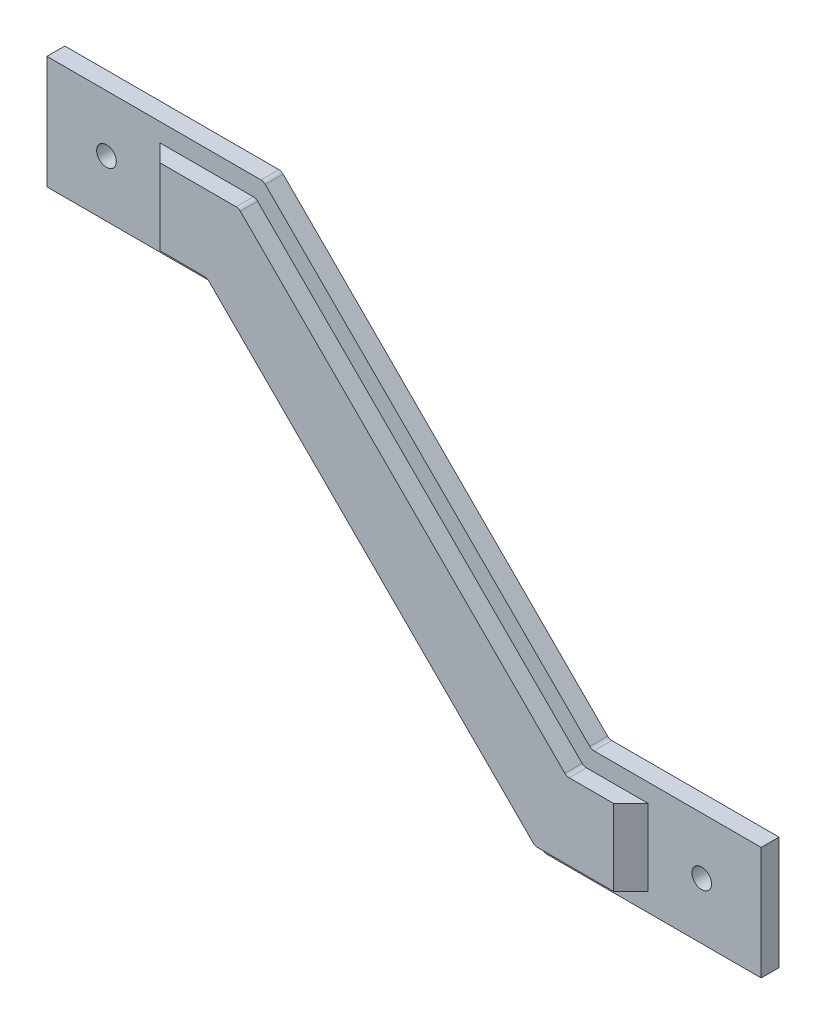
ISO-10303-21;
HEADER;
FILE_DESCRIPTION(('STEP AP214'),'2;1');
FILE_NAME('part.step','',(''),(''),'','','');
FILE_SCHEMA(('AUTOMOTIVE_DESIGN { 1 0 10303 214 1 1 1 1 }'));
ENDSEC;
DATA;
#1=APPLICATION_CONTEXT('core data for automotive mechanical design processes');
#2=APPLICATION_PROTOCOL_DEFINITION('international standard','automotive_design',2000,#1);
#3=PRODUCT_CONTEXT('',#1,'mechanical');
#4=PRODUCT('Part','Part','',(#3));
#5=PRODUCT_RELATED_PRODUCT_CATEGORY('part','',(#4));
#6=PRODUCT_DEFINITION_FORMATION('','',#4);
#7=PRODUCT_DEFINITION_CONTEXT('part definition',#1,'design');
#8=PRODUCT_DEFINITION('design','',#6,#7);
#9=PRODUCT_DEFINITION_SHAPE('','',#8);
#10=(LENGTH_UNIT() NAMED_UNIT(*) SI_UNIT(.MILLI.,.METRE.));
#11=(NAMED_UNIT(*) PLANE_ANGLE_UNIT() SI_UNIT($,.RADIAN.));
#12=(NAMED_UNIT(*) SI_UNIT($,.STERADIAN.) SOLID_ANGLE_UNIT());
#13=UNCERTAINTY_MEASURE_WITH_UNIT(LENGTH_MEASURE(1.E-05),#10,'distance_accuracy_value','');
#14=(GEOMETRIC_REPRESENTATION_CONTEXT(3) GLOBAL_UNCERTAINTY_ASSIGNED_CONTEXT((#13)) GLOBAL_UNIT_ASSIGNED_CONTEXT((#10,
#11,#12)) REPRESENTATION_CONTEXT('',''));
#15=CARTESIAN_POINT('',(0.,0.,0.));
#16=DIRECTION('',(0.,0.,1.));
#17=DIRECTION('',(1.,0.,0.));
#18=AXIS2_PLACEMENT_3D('',#15,#16,#17);
#19=CARTESIAN_POINT('',(0.,0.,3.));
#20=DIRECTION('',(0.,0.,-1.));
#21=DIRECTION('',(-1.,0.,0.));
#22=AXIS2_PLACEMENT_3D('',#19,#20,#21);
#23=PLANE('',#22);
#24=CARTESIAN_POINT('',(50.,-27.55,3.));
#25=DIRECTION('',(0.,0.,1.));
#26=DIRECTION('',(1.,0.,0.));
#27=AXIS2_PLACEMENT_3D('',#24,#25,#26);
#28=CIRCLE('',#27,1.65);
#29=CARTESIAN_POINT('',(51.65,-27.55,3.));
#30=VERTEX_POINT('',#29);
#31=EDGE_CURVE('E379',#30,#30,#28,.T.);
#32=ORIENTED_EDGE('',*,*,#31,.F.);
#33=EDGE_LOOP('',(#32));
#34=FACE_BOUND('',#33,.T.);
#35=CARTESIAN_POINT('',(-50.,27.55,3.));
#36=DIRECTION('',(0.,0.,1.));
#37=DIRECTION('',(1.,0.,0.));
#38=AXIS2_PLACEMENT_3D('',#35,#36,#37);
#39=CIRCLE('',#38,1.65);
#40=CARTESIAN_POINT('',(-48.35,27.55,3.));
#41=VERTEX_POINT('',#40);
#42=EDGE_CURVE('E331',#41,#41,#39,.T.);
#43=ORIENTED_EDGE('',*,*,#42,.F.);
#44=EDGE_LOOP('',(#43));
#45=FACE_BOUND('',#44,.T.);
#46=DIRECTION('',(-0.707106781186546,0.707106781186549,0.));
#47=VECTOR('',#46,1.);
#48=CARTESIAN_POINT('',(-23.6149711574555,37.05,3.));
#49=LINE('',#48,#47);
#50=CARTESIAN_POINT('',(31.1921356237317,-17.7571067811874,3.));
#51=VERTEX_POINT('',#50);
#52=CARTESIAN_POINT('',(-23.322077938642,36.7571067811865,3.));
#53=VERTEX_POINT('',#52);
#54=EDGE_CURVE('E368',#51,#53,#49,.T.);
#55=ORIENTED_EDGE('',*,*,#54,.T.);
#56=CARTESIAN_POINT('',(-24.0291847198286,36.05,3.));
#57=DIRECTION('',(0.,0.,-1.));
#58=DIRECTION('',(-1.,0.,0.));
#59=AXIS2_PLACEMENT_3D('',#56,#57,#58);
#60=CIRCLE('',#59,1.);
#61=CARTESIAN_POINT('',(-24.0291847198286,37.05,3.));
#62=VERTEX_POINT('',#61);
#63=EDGE_CURVE('E274',#53,#62,#60,.F.);
#64=ORIENTED_EDGE('',*,*,#63,.T.);
#65=DIRECTION('',(-1.,0.,0.));
#66=VECTOR('',#65,1.);
#67=CARTESIAN_POINT('',(-60.,37.05,3.));
#68=LINE('',#67,#66);
#69=CARTESIAN_POINT('',(-60.,37.05,3.));
#70=VERTEX_POINT('',#69);
#71=EDGE_CURVE('E213',#62,#70,#68,.T.);
#72=ORIENTED_EDGE('',*,*,#71,.T.);
#73=DIRECTION('',(0.,-1.,0.));
#74=VECTOR('',#73,1.);
#75=CARTESIAN_POINT('',(-60.,18.05,3.));
#76=LINE('',#75,#74);
#77=CARTESIAN_POINT('',(-60.,18.05,3.));
#78=VERTEX_POINT('',#77);
#79=EDGE_CURVE('E208',#70,#78,#76,.T.);
#80=ORIENTED_EDGE('',*,*,#79,.T.);
#81=DIRECTION('',(1.,0.,0.));
#82=VECTOR('',#81,1.);
#83=CARTESIAN_POINT('',(-31.4850288425443,18.05,3.));
#84=LINE('',#83,#82);
#85=CARTESIAN_POINT('',(-31.8992424049174,18.05,3.));
#86=VERTEX_POINT('',#85);
#87=EDGE_CURVE('E196',#78,#86,#84,.T.);
#88=ORIENTED_EDGE('',*,*,#87,.T.);
#89=CARTESIAN_POINT('',(-31.8992424049174,17.05,3.));
#90=DIRECTION('',(0.,0.,-1.));
#91=DIRECTION('',(-1.,0.,0.));
#92=AXIS2_PLACEMENT_3D('',#89,#90,#91);
#93=CIRCLE('',#92,1.);
#94=CARTESIAN_POINT('',(-31.1921356237309,17.7571067811866,3.));
#95=VERTEX_POINT('',#94);
#96=EDGE_CURVE('E44',#86,#95,#93,.T.);
#97=ORIENTED_EDGE('',*,*,#96,.T.);
#98=DIRECTION('',(0.707106781186547,-0.707106781186549,0.));
#99=VECTOR('',#98,1.);
#100=CARTESIAN_POINT('',(23.6149711574555,-37.05,3.));
#101=LINE('',#100,#99);
#102=CARTESIAN_POINT('',(23.3220779386421,-36.7571067811866,3.));
#103=VERTEX_POINT('',#102);
#104=EDGE_CURVE('E207',#95,#103,#101,.T.);
#105=ORIENTED_EDGE('',*,*,#104,.T.);
#106=CARTESIAN_POINT('',(24.0291847198286,-36.05,3.));
#107=DIRECTION('',(0.,0.,-1.));
#108=DIRECTION('',(-1.,0.,0.));
#109=AXIS2_PLACEMENT_3D('',#106,#107,#108);
#110=CIRCLE('',#109,1.);
#111=CARTESIAN_POINT('',(24.0291847198286,-37.05,3.));
#112=VERTEX_POINT('',#111);
#113=EDGE_CURVE('E270',#103,#112,#110,.F.);
#114=ORIENTED_EDGE('',*,*,#113,.T.);
#115=DIRECTION('',(1.,0.,0.));
#116=VECTOR('',#115,1.);
#117=CARTESIAN_POINT('',(60.,-37.05,3.));
#118=LINE('',#117,#116);
#119=CARTESIAN_POINT('',(60.,-37.05,3.));
#120=VERTEX_POINT('',#119);
#121=EDGE_CURVE('E319',#112,#120,#118,.T.);
#122=ORIENTED_EDGE('',*,*,#121,.T.);
#123=DIRECTION('',(0.,1.,0.));
#124=VECTOR('',#123,1.);
#125=CARTESIAN_POINT('',(60.,-18.05,3.));
#126=LINE('',#125,#124);
#127=CARTESIAN_POINT('',(60.,-18.05,3.));
#128=VERTEX_POINT('',#127);
#129=EDGE_CURVE('E371',#120,#128,#126,.T.);
#130=ORIENTED_EDGE('',*,*,#129,.T.);
#131=DIRECTION('',(-1.,0.,0.));
#132=VECTOR('',#131,1.);
#133=CARTESIAN_POINT('',(31.4850288425451,-18.0500000000008,3.));
#134=LINE('',#133,#132);
#135=CARTESIAN_POINT('',(31.8992424049183,-18.0500000000008,3.));
#136=VERTEX_POINT('',#135);
#137=EDGE_CURVE('E354',#128,#136,#134,.T.);
#138=ORIENTED_EDGE('',*,*,#137,.T.);
#139=CARTESIAN_POINT('',(31.8992424049182,-17.0500000000008,3.));
#140=DIRECTION('',(0.,0.,-1.));
#141=DIRECTION('',(-1.,0.,0.));
#142=AXIS2_PLACEMENT_3D('',#139,#140,#141);
#143=CIRCLE('',#142,1.);
#144=EDGE_CURVE('E303',#136,#51,#143,.T.);
#145=ORIENTED_EDGE('',*,*,#144,.T.);
#146=EDGE_LOOP('',(#55,#64,#72,#80,#88,#97,#105,#114,#122,#130,#138,#145));
#147=FACE_BOUND('',#146,.T.);
#148=DIRECTION('',(-0.707106781186548,0.707106781186548,0.));
#149=VECTOR('',#148,1.);
#150=CARTESIAN_POINT('',(30.2009667991878,-21.15,3.));
#151=LINE('',#150,#149);
#152=CARTESIAN_POINT('',(29.9080735803744,-20.8571067811866,3.));
#153=VERTEX_POINT('',#152);
#154=CARTESIAN_POINT('',(-24.6061399819987,33.6571067811865,3.));
#155=VERTEX_POINT('',#154);
#156=EDGE_CURVE('E388',#153,#155,#151,.T.);
#157=ORIENTED_EDGE('',*,*,#156,.F.);
#158=CARTESIAN_POINT('',(30.6151803615609,-20.15,3.));
#159=DIRECTION('',(0.,0.,-1.));
#160=DIRECTION('',(-1.,0.,0.));
#161=AXIS2_PLACEMENT_3D('',#158,#159,#160);
#162=CIRCLE('',#161,1.);
#163=CARTESIAN_POINT('',(30.6151803615609,-21.15,3.));
#164=VERTEX_POINT('',#163);
#165=EDGE_CURVE('E272',#153,#164,#162,.F.);
#166=ORIENTED_EDGE('',*,*,#165,.T.);
#167=DIRECTION('',(-1.,0.,0.));
#168=VECTOR('',#167,1.);
#169=CARTESIAN_POINT('',(41.,-21.15,3.));
#170=LINE('',#169,#168);
#171=CARTESIAN_POINT('',(41.,-21.15,3.));
#172=VERTEX_POINT('',#171);
#173=EDGE_CURVE('E392',#172,#164,#170,.T.);
#174=ORIENTED_EDGE('',*,*,#173,.F.);
#175=DIRECTION('',(0.,1.,0.));
#176=VECTOR('',#175,1.);
#177=CARTESIAN_POINT('',(41.,-33.95,3.));
#178=LINE('',#177,#176);
#179=CARTESIAN_POINT('',(41.,-33.95,3.));
#180=VERTEX_POINT('',#179);
#181=EDGE_CURVE('E395',#180,#172,#178,.T.);
#182=ORIENTED_EDGE('',*,*,#181,.F.);
#183=DIRECTION('',(1.,0.,0.));
#184=VECTOR('',#183,1.);
#185=CARTESIAN_POINT('',(24.8990332008122,-33.95,3.));
#186=LINE('',#185,#184);
#187=CARTESIAN_POINT('',(25.3132467631853,-33.95,3.));
#188=VERTEX_POINT('',#187);
#189=EDGE_CURVE('E398',#188,#180,#186,.T.);
#190=ORIENTED_EDGE('',*,*,#189,.F.);
#191=CARTESIAN_POINT('',(25.3132467631853,-32.95,3.));
#192=DIRECTION('',(0.,0.,-1.));
#193=DIRECTION('',(-1.,0.,0.));
#194=AXIS2_PLACEMENT_3D('',#191,#192,#193);
#195=CIRCLE('',#194,1.);
#196=CARTESIAN_POINT('',(24.6061399819988,-33.6571067811866,3.));
#197=VERTEX_POINT('',#196);
#198=EDGE_CURVE('E57',#188,#197,#195,.T.);
#199=ORIENTED_EDGE('',*,*,#198,.T.);
#200=DIRECTION('',(0.707106781186548,-0.707106781186547,0.));
#201=VECTOR('',#200,1.);
#202=CARTESIAN_POINT('',(-30.2009667991878,21.15,3.));
#203=LINE('',#202,#201);
#204=CARTESIAN_POINT('',(-29.9080735803744,20.8571067811865,3.));
#205=VERTEX_POINT('',#204);
#206=EDGE_CURVE('E400',#205,#197,#203,.T.);
#207=ORIENTED_EDGE('',*,*,#206,.F.);
#208=CARTESIAN_POINT('',(-30.6151803615609,20.15,3.));
#209=DIRECTION('',(0.,0.,-1.));
#210=DIRECTION('',(-1.,0.,0.));
#211=AXIS2_PLACEMENT_3D('',#208,#209,#210);
#212=CIRCLE('',#211,1.);
#213=CARTESIAN_POINT('',(-30.6151803615609,21.15,3.));
#214=VERTEX_POINT('',#213);
#215=EDGE_CURVE('E51',#205,#214,#212,.F.);
#216=ORIENTED_EDGE('',*,*,#215,.T.);
#217=DIRECTION('',(1.,0.,0.));
#218=VECTOR('',#217,1.);
#219=CARTESIAN_POINT('',(-41.,21.15,3.));
#220=LINE('',#219,#218);
#221=CARTESIAN_POINT('',(-41.,21.15,3.));
#222=VERTEX_POINT('',#221);
#223=EDGE_CURVE('E402',#222,#214,#220,.T.);
#224=ORIENTED_EDGE('',*,*,#223,.F.);
#225=DIRECTION('',(0.,-1.,0.));
#226=VECTOR('',#225,1.);
#227=CARTESIAN_POINT('',(-41.,33.95,3.));
#228=LINE('',#227,#226);
#229=CARTESIAN_POINT('',(-41.,33.95,3.));
#230=VERTEX_POINT('',#229);
#231=EDGE_CURVE('E404',#230,#222,#228,.T.);
#232=ORIENTED_EDGE('',*,*,#231,.F.);
#233=DIRECTION('',(-1.,0.,0.));
#234=VECTOR('',#233,1.);
#235=CARTESIAN_POINT('',(-24.8990332008122,33.95,3.));
#236=LINE('',#235,#234);
#237=CARTESIAN_POINT('',(-25.3132467631853,33.95,3.));
#238=VERTEX_POINT('',#237);
#239=EDGE_CURVE('E407',#238,#230,#236,.T.);
#240=ORIENTED_EDGE('',*,*,#239,.F.);
#241=CARTESIAN_POINT('',(-25.3132467631853,32.95,3.));
#242=DIRECTION('',(0.,0.,-1.));
#243=DIRECTION('',(-1.,0.,0.));
#244=AXIS2_PLACEMENT_3D('',#241,#242,#243);
#245=CIRCLE('',#244,1.);
#246=EDGE_CURVE('E299',#238,#155,#245,.T.);
#247=ORIENTED_EDGE('',*,*,#246,.T.);
#248=EDGE_LOOP('',(#157,#166,#174,#182,#190,#199,#207,#216,#224,#232,#240,#247));
#249=FACE_BOUND('',#248,.T.);
#250=ADVANCED_FACE('F36',(#34,#45,#147,#249),#23,.F.);
#251=CARTESIAN_POINT('',(0.,0.,0.));
#252=DIRECTION('',(0.,0.,-1.));
#253=DIRECTION('',(-1.,0.,0.));
#254=AXIS2_PLACEMENT_3D('',#251,#252,#253);
#255=PLANE('',#254);
#256=CARTESIAN_POINT('',(-50.,27.55,0.));
#257=DIRECTION('',(0.,0.,1.));
#258=DIRECTION('',(1.,0.,0.));
#259=AXIS2_PLACEMENT_3D('',#256,#257,#258);
#260=CIRCLE('',#259,1.65);
#261=CARTESIAN_POINT('',(-48.35,27.55,0.));
#262=VERTEX_POINT('',#261);
#263=EDGE_CURVE('E376',#262,#262,#260,.T.);
#264=ORIENTED_EDGE('',*,*,#263,.T.);
#265=EDGE_LOOP('',(#264));
#266=FACE_BOUND('',#265,.T.);
#267=DIRECTION('',(-1.,0.,0.));
#268=VECTOR('',#267,1.);
#269=CARTESIAN_POINT('',(-60.,37.05,0.));
#270=LINE('',#269,#268);
#271=CARTESIAN_POINT('',(-24.0291847198286,37.05,0.));
#272=VERTEX_POINT('',#271);
#273=CARTESIAN_POINT('',(-60.,37.05,0.));
#274=VERTEX_POINT('',#273);
#275=EDGE_CURVE('E217',#272,#274,#270,.T.);
#276=ORIENTED_EDGE('',*,*,#275,.F.);
#277=CARTESIAN_POINT('',(-24.0291847198286,36.05,0.));
#278=DIRECTION('',(0.,0.,-1.));
#279=DIRECTION('',(-1.,0.,0.));
#280=AXIS2_PLACEMENT_3D('',#277,#278,#279);
#281=CIRCLE('',#280,1.);
#282=CARTESIAN_POINT('',(-23.322077938642,36.7571067811865,0.));
#283=VERTEX_POINT('',#282);
#284=EDGE_CURVE('E262',#272,#283,#281,.T.);
#285=ORIENTED_EDGE('',*,*,#284,.T.);
#286=DIRECTION('',(-0.707106781186546,0.707106781186549,0.));
#287=VECTOR('',#286,1.);
#288=CARTESIAN_POINT('',(-23.6149711574555,37.05,0.));
#289=LINE('',#288,#287);
#290=CARTESIAN_POINT('',(31.1921356237317,-17.7571067811874,0.));
#291=VERTEX_POINT('',#290);
#292=EDGE_CURVE('E341',#291,#283,#289,.T.);
#293=ORIENTED_EDGE('',*,*,#292,.F.);
#294=CARTESIAN_POINT('',(31.8992424049182,-17.0500000000008,0.));
#295=DIRECTION('',(0.,0.,-1.));
#296=DIRECTION('',(-1.,0.,0.));
#297=AXIS2_PLACEMENT_3D('',#294,#295,#296);
#298=CIRCLE('',#297,1.);
#299=CARTESIAN_POINT('',(31.8992424049183,-18.0500000000008,0.));
#300=VERTEX_POINT('',#299);
#301=EDGE_CURVE('E301',#291,#300,#298,.F.);
#302=ORIENTED_EDGE('',*,*,#301,.T.);
#303=DIRECTION('',(-1.,0.,0.));
#304=VECTOR('',#303,1.);
#305=CARTESIAN_POINT('',(31.4850288425451,-18.0500000000008,0.));
#306=LINE('',#305,#304);
#307=CARTESIAN_POINT('',(60.,-18.05,0.));
#308=VERTEX_POINT('',#307);
#309=EDGE_CURVE('E338',#308,#300,#306,.T.);
#310=ORIENTED_EDGE('',*,*,#309,.F.);
#311=DIRECTION('',(0.,1.,0.));
#312=VECTOR('',#311,1.);
#313=CARTESIAN_POINT('',(60.,-18.05,0.));
#314=LINE('',#313,#312);
#315=CARTESIAN_POINT('',(60.,-37.05,0.));
#316=VERTEX_POINT('',#315);
#317=EDGE_CURVE('E336',#316,#308,#314,.T.);
#318=ORIENTED_EDGE('',*,*,#317,.F.);
#319=DIRECTION('',(1.,0.,0.));
#320=VECTOR('',#319,1.);
#321=CARTESIAN_POINT('',(60.,-37.05,0.));
#322=LINE('',#321,#320);
#323=CARTESIAN_POINT('',(24.0291847198286,-37.05,0.));
#324=VERTEX_POINT('',#323);
#325=EDGE_CURVE('E329',#324,#316,#322,.T.);
#326=ORIENTED_EDGE('',*,*,#325,.F.);
#327=CARTESIAN_POINT('',(24.0291847198286,-36.05,0.));
#328=DIRECTION('',(0.,0.,-1.));
#329=DIRECTION('',(-1.,0.,0.));
#330=AXIS2_PLACEMENT_3D('',#327,#328,#329);
#331=CIRCLE('',#330,1.);
#332=CARTESIAN_POINT('',(23.3220779386421,-36.7571067811866,0.));
#333=VERTEX_POINT('',#332);
#334=EDGE_CURVE('E260',#324,#333,#331,.T.);
#335=ORIENTED_EDGE('',*,*,#334,.T.);
#336=DIRECTION('',(0.707106781186547,-0.707106781186549,0.));
#337=VECTOR('',#336,1.);
#338=CARTESIAN_POINT('',(23.6149711574555,-37.05,0.));
#339=LINE('',#338,#337);
#340=CARTESIAN_POINT('',(-31.1921356237309,17.7571067811866,0.));
#341=VERTEX_POINT('',#340);
#342=EDGE_CURVE('E327',#341,#333,#339,.T.);
#343=ORIENTED_EDGE('',*,*,#342,.F.);
#344=CARTESIAN_POINT('',(-31.8992424049174,17.05,0.));
#345=DIRECTION('',(0.,0.,-1.));
#346=DIRECTION('',(-1.,0.,0.));
#347=AXIS2_PLACEMENT_3D('',#344,#345,#346);
#348=CIRCLE('',#347,1.);
#349=CARTESIAN_POINT('',(-31.8992424049174,18.05,0.));
#350=VERTEX_POINT('',#349);
#351=EDGE_CURVE('E308',#341,#350,#348,.F.);
#352=ORIENTED_EDGE('',*,*,#351,.T.);
#353=DIRECTION('',(1.,0.,0.));
#354=VECTOR('',#353,1.);
#355=CARTESIAN_POINT('',(-31.4850288425443,18.05,0.));
#356=LINE('',#355,#354);
#357=CARTESIAN_POINT('',(-60.,18.05,0.));
#358=VERTEX_POINT('',#357);
#359=EDGE_CURVE('E326',#358,#350,#356,.T.);
#360=ORIENTED_EDGE('',*,*,#359,.F.);
#361=DIRECTION('',(0.,-1.,0.));
#362=VECTOR('',#361,1.);
#363=CARTESIAN_POINT('',(-60.,18.05,0.));
#364=LINE('',#363,#362);
#365=EDGE_CURVE('E221',#274,#358,#364,.T.);
#366=ORIENTED_EDGE('',*,*,#365,.F.);
#367=EDGE_LOOP('',(#276,#285,#293,#302,#310,#318,#326,#335,#343,#352,#360,#366));
#368=FACE_BOUND('',#367,.T.);
#369=CARTESIAN_POINT('',(50.,-27.55,0.));
#370=DIRECTION('',(0.,0.,1.));
#371=DIRECTION('',(1.,0.,0.));
#372=AXIS2_PLACEMENT_3D('',#369,#370,#371);
#373=CIRCLE('',#372,1.65);
#374=CARTESIAN_POINT('',(51.65,-27.55,0.));
#375=VERTEX_POINT('',#374);
#376=EDGE_CURVE('E382',#375,#375,#373,.T.);
#377=ORIENTED_EDGE('',*,*,#376,.T.);
#378=EDGE_LOOP('',(#377));
#379=FACE_BOUND('',#378,.T.);
#380=ADVANCED_FACE('F324',(#266,#368,#379),#255,.T.);
#381=CARTESIAN_POINT('',(-60.,18.05,3.));
#382=DIRECTION('',(1.,0.,0.));
#383=DIRECTION('',(0.,0.,-1.));
#384=AXIS2_PLACEMENT_3D('',#381,#382,#383);
#385=PLANE('',#384);
#386=ORIENTED_EDGE('',*,*,#365,.T.);
#387=DIRECTION('',(0.,0.,-1.));
#388=VECTOR('',#387,1.);
#389=CARTESIAN_POINT('',(-60.,18.05,3.));
#390=LINE('',#389,#388);
#391=EDGE_CURVE('E201',#78,#358,#390,.T.);
#392=ORIENTED_EDGE('',*,*,#391,.F.);
#393=ORIENTED_EDGE('',*,*,#79,.F.);
#394=DIRECTION('',(0.,0.,-1.));
#395=VECTOR('',#394,1.);
#396=CARTESIAN_POINT('',(-60.,37.05,3.));
#397=LINE('',#396,#395);
#398=EDGE_CURVE('E345',#70,#274,#397,.T.);
#399=ORIENTED_EDGE('',*,*,#398,.T.);
#400=EDGE_LOOP('',(#386,#392,#393,#399));
#401=FACE_BOUND('',#400,.T.);
#402=ADVANCED_FACE('F219',(#401),#385,.F.);
#403=CARTESIAN_POINT('',(-31.4850288425443,18.05,3.));
#404=DIRECTION('',(0.,1.,0.));
#405=DIRECTION('',(-1.,0.,0.));
#406=AXIS2_PLACEMENT_3D('',#403,#404,#405);
#407=PLANE('',#406);
#408=ORIENTED_EDGE('',*,*,#359,.T.);
#409=DIRECTION('',(0.,0.,-1.));
#410=VECTOR('',#409,1.);
#411=CARTESIAN_POINT('',(-31.8992424049174,18.05,3.));
#412=LINE('',#411,#410);
#413=EDGE_CURVE('E204',#350,#86,#412,.F.);
#414=ORIENTED_EDGE('',*,*,#413,.T.);
#415=ORIENTED_EDGE('',*,*,#87,.F.);
#416=ORIENTED_EDGE('',*,*,#391,.T.);
#417=EDGE_LOOP('',(#408,#414,#415,#416));
#418=FACE_BOUND('',#417,.T.);
#419=ADVANCED_FACE('F199',(#418),#407,.F.);
#420=CARTESIAN_POINT('',(23.6149711574555,-37.05,3.));
#421=DIRECTION('',(0.707106781186548,0.707106781186546,0.));
#422=DIRECTION('',(-0.707106781186547,0.707106781186549,0.));
#423=AXIS2_PLACEMENT_3D('',#420,#421,#422);
#424=PLANE('',#423);
#425=ORIENTED_EDGE('',*,*,#342,.T.);
#426=DIRECTION('',(0.,0.,-1.));
#427=VECTOR('',#426,1.);
#428=CARTESIAN_POINT('',(23.3220779386421,-36.7571067811866,3.));
#429=LINE('',#428,#427);
#430=EDGE_CURVE('E286',#333,#103,#429,.F.);
#431=ORIENTED_EDGE('',*,*,#430,.T.);
#432=ORIENTED_EDGE('',*,*,#104,.F.);
#433=DIRECTION('',(0.,0.,-1.));
#434=VECTOR('',#433,1.);
#435=CARTESIAN_POINT('',(-31.1921356237309,17.7571067811866,0.));
#436=LINE('',#435,#434);
#437=EDGE_CURVE('E283',#95,#341,#436,.T.);
#438=ORIENTED_EDGE('',*,*,#437,.T.);
#439=EDGE_LOOP('',(#425,#431,#432,#438));
#440=FACE_BOUND('',#439,.T.);
#441=ADVANCED_FACE('F316',(#440),#424,.F.);
#442=CARTESIAN_POINT('',(60.,-37.05,3.));
#443=DIRECTION('',(0.,1.,0.));
#444=DIRECTION('',(-1.,0.,0.));
#445=AXIS2_PLACEMENT_3D('',#442,#443,#444);
#446=PLANE('',#445);
#447=ORIENTED_EDGE('',*,*,#121,.F.);
#448=DIRECTION('',(0.,0.,-1.));
#449=VECTOR('',#448,1.);
#450=CARTESIAN_POINT('',(24.0291847198286,-37.05,3.));
#451=LINE('',#450,#449);
#452=EDGE_CURVE('E280',#112,#324,#451,.T.);
#453=ORIENTED_EDGE('',*,*,#452,.T.);
#454=ORIENTED_EDGE('',*,*,#325,.T.);
#455=DIRECTION('',(0.,0.,-1.));
#456=VECTOR('',#455,1.);
#457=CARTESIAN_POINT('',(60.,-37.05,3.));
#458=LINE('',#457,#456);
#459=EDGE_CURVE('E223',#120,#316,#458,.T.);
#460=ORIENTED_EDGE('',*,*,#459,.F.);
#461=EDGE_LOOP('',(#447,#453,#454,#460));
#462=FACE_BOUND('',#461,.T.);
#463=ADVANCED_FACE('F483',(#462),#446,.F.);
#464=CARTESIAN_POINT('',(60.,-18.05,3.));
#465=DIRECTION('',(-1.,0.,0.));
#466=DIRECTION('',(0.,0.,1.));
#467=AXIS2_PLACEMENT_3D('',#464,#465,#466);
#468=PLANE('',#467);
#469=ORIENTED_EDGE('',*,*,#317,.T.);
#470=DIRECTION('',(0.,0.,-1.));
#471=VECTOR('',#470,1.);
#472=CARTESIAN_POINT('',(60.,-18.05,3.));
#473=LINE('',#472,#471);
#474=EDGE_CURVE('E229',#128,#308,#473,.T.);
#475=ORIENTED_EDGE('',*,*,#474,.F.);
#476=ORIENTED_EDGE('',*,*,#129,.F.);
#477=ORIENTED_EDGE('',*,*,#459,.T.);
#478=EDGE_LOOP('',(#469,#475,#476,#477));
#479=FACE_BOUND('',#478,.T.);
#480=ADVANCED_FACE('F480',(#479),#468,.F.);
#481=CARTESIAN_POINT('',(31.4850288425451,-18.0500000000008,3.));
#482=DIRECTION('',(0.,-1.,0.));
#483=DIRECTION('',(1.,0.,0.));
#484=AXIS2_PLACEMENT_3D('',#481,#482,#483);
#485=PLANE('',#484);
#486=ORIENTED_EDGE('',*,*,#309,.T.);
#487=DIRECTION('',(0.,0.,-1.));
#488=VECTOR('',#487,1.);
#489=CARTESIAN_POINT('',(31.8992424049183,-18.0500000000008,3.));
#490=LINE('',#489,#488);
#491=EDGE_CURVE('E276',#300,#136,#490,.F.);
#492=ORIENTED_EDGE('',*,*,#491,.T.);
#493=ORIENTED_EDGE('',*,*,#137,.F.);
#494=ORIENTED_EDGE('',*,*,#474,.T.);
#495=EDGE_LOOP('',(#486,#492,#493,#494));
#496=FACE_BOUND('',#495,.T.);
#497=ADVANCED_FACE('F351',(#496),#485,.F.);
#498=CARTESIAN_POINT('',(-23.6149711574555,37.05,3.));
#499=DIRECTION('',(-0.707106781186549,-0.707106781186546,0.));
#500=DIRECTION('',(0.707106781186546,-0.707106781186549,0.));
#501=AXIS2_PLACEMENT_3D('',#498,#499,#500);
#502=PLANE('',#501);
#503=ORIENTED_EDGE('',*,*,#292,.T.);
#504=DIRECTION('',(0.,0.,-1.));
#505=VECTOR('',#504,1.);
#506=CARTESIAN_POINT('',(-23.322077938642,36.7571067811865,3.));
#507=LINE('',#506,#505);
#508=EDGE_CURVE('E267',#283,#53,#507,.F.);
#509=ORIENTED_EDGE('',*,*,#508,.T.);
#510=ORIENTED_EDGE('',*,*,#54,.F.);
#511=DIRECTION('',(0.,0.,-1.));
#512=VECTOR('',#511,1.);
#513=CARTESIAN_POINT('',(31.1921356237317,-17.7571067811874,0.));
#514=LINE('',#513,#512);
#515=EDGE_CURVE('E264',#51,#291,#514,.T.);
#516=ORIENTED_EDGE('',*,*,#515,.T.);
#517=EDGE_LOOP('',(#503,#509,#510,#516));
#518=FACE_BOUND('',#517,.T.);
#519=ADVANCED_FACE('F366',(#518),#502,.F.);
#520=CARTESIAN_POINT('',(-60.,37.05,3.));
#521=DIRECTION('',(0.,-1.,0.));
#522=DIRECTION('',(0.,0.,-1.));
#523=AXIS2_PLACEMENT_3D('',#520,#521,#522);
#524=PLANE('',#523);
#525=ORIENTED_EDGE('',*,*,#71,.F.);
#526=DIRECTION('',(0.,0.,-1.));
#527=VECTOR('',#526,1.);
#528=CARTESIAN_POINT('',(-24.0291847198286,37.05,3.));
#529=LINE('',#528,#527);
#530=EDGE_CURVE('E257',#62,#272,#529,.T.);
#531=ORIENTED_EDGE('',*,*,#530,.T.);
#532=ORIENTED_EDGE('',*,*,#275,.T.);
#533=ORIENTED_EDGE('',*,*,#398,.F.);
#534=EDGE_LOOP('',(#525,#531,#532,#533));
#535=FACE_BOUND('',#534,.T.);
#536=ADVANCED_FACE('F472',(#535),#524,.F.);
#537=CARTESIAN_POINT('',(-50.,27.55,3.));
#538=DIRECTION('',(0.,0.,-1.));
#539=DIRECTION('',(-1.,0.,0.));
#540=AXIS2_PLACEMENT_3D('',#537,#538,#539);
#541=CYLINDRICAL_SURFACE('',#540,1.65);
#542=ORIENTED_EDGE('',*,*,#42,.T.);
#543=EDGE_LOOP('',(#542));
#544=FACE_BOUND('',#543,.T.);
#545=ORIENTED_EDGE('',*,*,#263,.F.);
#546=EDGE_LOOP('',(#545));
#547=FACE_BOUND('',#546,.T.);
#548=ADVANCED_FACE('F469',(#544,#547),#541,.F.);
#549=CARTESIAN_POINT('',(50.,-27.55,3.));
#550=DIRECTION('',(0.,0.,-1.));
#551=DIRECTION('',(-1.,0.,0.));
#552=AXIS2_PLACEMENT_3D('',#549,#550,#551);
#553=CYLINDRICAL_SURFACE('',#552,1.65);
#554=ORIENTED_EDGE('',*,*,#31,.T.);
#555=EDGE_LOOP('',(#554));
#556=FACE_BOUND('',#555,.T.);
#557=ORIENTED_EDGE('',*,*,#376,.F.);
#558=EDGE_LOOP('',(#557));
#559=FACE_BOUND('',#558,.T.);
#560=ADVANCED_FACE('F644',(#556,#559),#553,.F.);
#561=CARTESIAN_POINT('',(-24.8990332008122,33.95,5.9));
#562=DIRECTION('',(0.,-1.,0.));
#563=DIRECTION('',(0.,0.,-1.));
#564=AXIS2_PLACEMENT_3D('',#561,#562,#563);
#565=PLANE('',#564);
#566=DIRECTION('',(-1.,0.,0.));
#567=VECTOR('',#566,1.);
#568=CARTESIAN_POINT('',(-24.8990332008122,33.95,5.9));
#569=LINE('',#568,#567);
#570=CARTESIAN_POINT('',(-25.3132467631853,33.95,5.9));
#571=VERTEX_POINT('',#570);
#572=CARTESIAN_POINT('',(-38.1,33.95,5.9));
#573=VERTEX_POINT('',#572);
#574=EDGE_CURVE('E391',#571,#573,#569,.T.);
#575=ORIENTED_EDGE('',*,*,#574,.F.);
#576=DIRECTION('',(0.,0.,-1.));
#577=VECTOR('',#576,1.);
#578=CARTESIAN_POINT('',(-25.3132467631853,33.95,5.9));
#579=LINE('',#578,#577);
#580=EDGE_CURVE('E245',#571,#238,#579,.T.);
#581=ORIENTED_EDGE('',*,*,#580,.T.);
#582=ORIENTED_EDGE('',*,*,#239,.T.);
#583=DIRECTION('',(0.707106781186548,0.,0.707106781186548));
#584=VECTOR('',#583,1.);
#585=CARTESIAN_POINT('',(-38.1,33.95,5.9));
#586=LINE('',#585,#584);
#587=EDGE_CURVE('E242',#230,#573,#586,.T.);
#588=ORIENTED_EDGE('',*,*,#587,.T.);
#589=EDGE_LOOP('',(#575,#581,#582,#588));
#590=FACE_BOUND('',#589,.T.);
#591=ADVANCED_FACE('F431',(#590),#565,.F.);
#592=CARTESIAN_POINT('',(-41.,21.15,5.9));
#593=DIRECTION('',(0.,1.,0.));
#594=DIRECTION('',(0.,0.,1.));
#595=AXIS2_PLACEMENT_3D('',#592,#593,#594);
#596=PLANE('',#595);
#597=ORIENTED_EDGE('',*,*,#223,.T.);
#598=DIRECTION('',(0.,0.,-1.));
#599=VECTOR('',#598,1.);
#600=CARTESIAN_POINT('',(-30.6151803615609,21.15,5.9));
#601=LINE('',#600,#599);
#602=CARTESIAN_POINT('',(-30.6151803615609,21.15,5.9));
#603=VERTEX_POINT('',#602);
#604=EDGE_CURVE('E297',#214,#603,#601,.F.);
#605=ORIENTED_EDGE('',*,*,#604,.T.);
#606=DIRECTION('',(1.,0.,0.));
#607=VECTOR('',#606,1.);
#608=CARTESIAN_POINT('',(-41.,21.15,5.9));
#609=LINE('',#608,#607);
#610=CARTESIAN_POINT('',(-38.1,21.15,5.9));
#611=VERTEX_POINT('',#610);
#612=EDGE_CURVE('E419',#611,#603,#609,.T.);
#613=ORIENTED_EDGE('',*,*,#612,.F.);
#614=DIRECTION('',(-0.707106781186548,0.,-0.707106781186548));
#615=VECTOR('',#614,1.);
#616=CARTESIAN_POINT('',(-38.1,21.15,5.9));
#617=LINE('',#616,#615);
#618=EDGE_CURVE('E240',#611,#222,#617,.T.);
#619=ORIENTED_EDGE('',*,*,#618,.T.);
#620=EDGE_LOOP('',(#597,#605,#613,#619));
#621=FACE_BOUND('',#620,.T.);
#622=ADVANCED_FACE('F437',(#621),#596,.F.);
#623=CARTESIAN_POINT('',(-30.2009667991878,21.15,5.9));
#624=DIRECTION('',(0.707106781186547,0.707106781186548,0.));
#625=DIRECTION('',(-0.707106781186548,0.707106781186547,0.));
#626=AXIS2_PLACEMENT_3D('',#623,#624,#625);
#627=PLANE('',#626);
#628=ORIENTED_EDGE('',*,*,#206,.T.);
#629=DIRECTION('',(0.,0.,-1.));
#630=VECTOR('',#629,1.);
#631=CARTESIAN_POINT('',(24.6061399819988,-33.6571067811866,5.9));
#632=LINE('',#631,#630);
#633=CARTESIAN_POINT('',(24.6061399819988,-33.6571067811866,5.9));
#634=VERTEX_POINT('',#633);
#635=EDGE_CURVE('E294',#197,#634,#632,.F.);
#636=ORIENTED_EDGE('',*,*,#635,.T.);
#637=DIRECTION('',(0.707106781186548,-0.707106781186547,0.));
#638=VECTOR('',#637,1.);
#639=CARTESIAN_POINT('',(-30.2009667991878,21.15,5.9));
#640=LINE('',#639,#638);
#641=CARTESIAN_POINT('',(-29.9080735803744,20.8571067811865,5.9));
#642=VERTEX_POINT('',#641);
#643=EDGE_CURVE('E416',#642,#634,#640,.T.);
#644=ORIENTED_EDGE('',*,*,#643,.F.);
#645=DIRECTION('',(0.,0.,-1.));
#646=VECTOR('',#645,1.);
#647=CARTESIAN_POINT('',(-29.9080735803744,20.8571067811865,3.));
#648=LINE('',#647,#646);
#649=EDGE_CURVE('E291',#642,#205,#648,.T.);
#650=ORIENTED_EDGE('',*,*,#649,.T.);
#651=EDGE_LOOP('',(#628,#636,#644,#650));
#652=FACE_BOUND('',#651,.T.);
#653=ADVANCED_FACE('F526',(#652),#627,.F.);
#654=CARTESIAN_POINT('',(24.8990332008122,-33.95,5.9));
#655=DIRECTION('',(0.,1.,0.));
#656=DIRECTION('',(0.,0.,1.));
#657=AXIS2_PLACEMENT_3D('',#654,#655,#656);
#658=PLANE('',#657);
#659=DIRECTION('',(1.,0.,0.));
#660=VECTOR('',#659,1.);
#661=CARTESIAN_POINT('',(24.8990332008122,-33.95,5.9));
#662=LINE('',#661,#660);
#663=CARTESIAN_POINT('',(25.3132467631853,-33.95,5.9));
#664=VERTEX_POINT('',#663);
#665=CARTESIAN_POINT('',(38.1,-33.95,5.9));
#666=VERTEX_POINT('',#665);
#667=EDGE_CURVE('E414',#664,#666,#662,.T.);
#668=ORIENTED_EDGE('',*,*,#667,.F.);
#669=DIRECTION('',(0.,0.,-1.));
#670=VECTOR('',#669,1.);
#671=CARTESIAN_POINT('',(25.3132467631853,-33.95,5.9));
#672=LINE('',#671,#670);
#673=EDGE_CURVE('E288',#664,#188,#672,.T.);
#674=ORIENTED_EDGE('',*,*,#673,.T.);
#675=ORIENTED_EDGE('',*,*,#189,.T.);
#676=DIRECTION('',(-0.707106781186548,0.,0.707106781186548));
#677=VECTOR('',#676,1.);
#678=CARTESIAN_POINT('',(38.1,-33.95,5.9));
#679=LINE('',#678,#677);
#680=EDGE_CURVE('E237',#180,#666,#679,.T.);
#681=ORIENTED_EDGE('',*,*,#680,.T.);
#682=EDGE_LOOP('',(#668,#674,#675,#681));
#683=FACE_BOUND('',#682,.T.);
#684=ADVANCED_FACE('F510',(#683),#658,.F.);
#685=CARTESIAN_POINT('',(41.,-21.15,5.9));
#686=DIRECTION('',(0.,-1.,0.));
#687=DIRECTION('',(0.,0.,-1.));
#688=AXIS2_PLACEMENT_3D('',#685,#686,#687);
#689=PLANE('',#688);
#690=ORIENTED_EDGE('',*,*,#173,.T.);
#691=DIRECTION('',(0.,0.,-1.));
#692=VECTOR('',#691,1.);
#693=CARTESIAN_POINT('',(30.6151803615609,-21.15,5.9));
#694=LINE('',#693,#692);
#695=CARTESIAN_POINT('',(30.6151803615609,-21.15,5.9));
#696=VERTEX_POINT('',#695);
#697=EDGE_CURVE('E278',#164,#696,#694,.F.);
#698=ORIENTED_EDGE('',*,*,#697,.T.);
#699=DIRECTION('',(-1.,0.,0.));
#700=VECTOR('',#699,1.);
#701=CARTESIAN_POINT('',(41.,-21.15,5.9));
#702=LINE('',#701,#700);
#703=CARTESIAN_POINT('',(38.1,-21.15,5.9));
#704=VERTEX_POINT('',#703);
#705=EDGE_CURVE('E411',#704,#696,#702,.T.);
#706=ORIENTED_EDGE('',*,*,#705,.F.);
#707=DIRECTION('',(0.707106781186548,0.,-0.707106781186548));
#708=VECTOR('',#707,1.);
#709=CARTESIAN_POINT('',(38.1,-21.15,5.9));
#710=LINE('',#709,#708);
#711=EDGE_CURVE('E235',#704,#172,#710,.T.);
#712=ORIENTED_EDGE('',*,*,#711,.T.);
#713=EDGE_LOOP('',(#690,#698,#706,#712));
#714=FACE_BOUND('',#713,.T.);
#715=ADVANCED_FACE('F515',(#714),#689,.F.);
#716=CARTESIAN_POINT('',(30.2009667991878,-21.15,5.9));
#717=DIRECTION('',(-0.707106781186547,-0.707106781186547,0.));
#718=DIRECTION('',(0.707106781186548,-0.707106781186548,0.));
#719=AXIS2_PLACEMENT_3D('',#716,#717,#718);
#720=PLANE('',#719);
#721=ORIENTED_EDGE('',*,*,#156,.T.);
#722=DIRECTION('',(0.,0.,-1.));
#723=VECTOR('',#722,1.);
#724=CARTESIAN_POINT('',(-24.6061399819987,33.6571067811865,5.9));
#725=LINE('',#724,#723);
#726=CARTESIAN_POINT('',(-24.6061399819987,33.6571067811865,5.9));
#727=VERTEX_POINT('',#726);
#728=EDGE_CURVE('E251',#155,#727,#725,.F.);
#729=ORIENTED_EDGE('',*,*,#728,.T.);
#730=DIRECTION('',(-0.707106781186548,0.707106781186548,0.));
#731=VECTOR('',#730,1.);
#732=CARTESIAN_POINT('',(30.2009667991878,-21.15,5.9));
#733=LINE('',#732,#731);
#734=CARTESIAN_POINT('',(29.9080735803744,-20.8571067811866,5.9));
#735=VERTEX_POINT('',#734);
#736=EDGE_CURVE('E385',#735,#727,#733,.T.);
#737=ORIENTED_EDGE('',*,*,#736,.F.);
#738=DIRECTION('',(0.,0.,-1.));
#739=VECTOR('',#738,1.);
#740=CARTESIAN_POINT('',(29.9080735803744,-20.8571067811866,3.));
#741=LINE('',#740,#739);
#742=EDGE_CURVE('E248',#735,#153,#741,.T.);
#743=ORIENTED_EDGE('',*,*,#742,.T.);
#744=EDGE_LOOP('',(#721,#729,#737,#743));
#745=FACE_BOUND('',#744,.T.);
#746=ADVANCED_FACE('F443',(#745),#720,.F.);
#747=CARTESIAN_POINT('',(0.,0.,5.9));
#748=DIRECTION('',(0.,0.,1.));
#749=DIRECTION('',(1.,0.,0.));
#750=AXIS2_PLACEMENT_3D('',#747,#748,#749);
#751=PLANE('',#750);
#752=ORIENTED_EDGE('',*,*,#736,.T.);
#753=CARTESIAN_POINT('',(-25.3132467631853,32.95,5.9));
#754=DIRECTION('',(0.,0.,1.));
#755=DIRECTION('',(1.,0.,0.));
#756=AXIS2_PLACEMENT_3D('',#753,#754,#755);
#757=CIRCLE('',#756,1.);
#758=EDGE_CURVE('E255',#727,#571,#757,.T.);
#759=ORIENTED_EDGE('',*,*,#758,.T.);
#760=ORIENTED_EDGE('',*,*,#574,.T.);
#761=DIRECTION('',(0.,-1.,0.));
#762=VECTOR('',#761,1.);
#763=CARTESIAN_POINT('',(-38.1,21.15,5.9));
#764=LINE('',#763,#762);
#765=EDGE_CURVE('E222',#573,#611,#764,.T.);
#766=ORIENTED_EDGE('',*,*,#765,.T.);
#767=ORIENTED_EDGE('',*,*,#612,.T.);
#768=CARTESIAN_POINT('',(-30.6151803615609,20.15,5.9));
#769=DIRECTION('',(0.,0.,1.));
#770=DIRECTION('',(1.,0.,0.));
#771=AXIS2_PLACEMENT_3D('',#768,#769,#770);
#772=CIRCLE('',#771,1.);
#773=EDGE_CURVE('E11',#603,#642,#772,.F.);
#774=ORIENTED_EDGE('',*,*,#773,.T.);
#775=ORIENTED_EDGE('',*,*,#643,.T.);
#776=CARTESIAN_POINT('',(25.3132467631853,-32.95,5.9));
#777=DIRECTION('',(0.,0.,1.));
#778=DIRECTION('',(1.,0.,0.));
#779=AXIS2_PLACEMENT_3D('',#776,#777,#778);
#780=CIRCLE('',#779,1.);
#781=EDGE_CURVE('E253',#634,#664,#780,.T.);
#782=ORIENTED_EDGE('',*,*,#781,.T.);
#783=ORIENTED_EDGE('',*,*,#667,.T.);
#784=DIRECTION('',(0.,1.,0.));
#785=VECTOR('',#784,1.);
#786=CARTESIAN_POINT('',(38.1,-21.15,5.9));
#787=LINE('',#786,#785);
#788=EDGE_CURVE('E226',#666,#704,#787,.T.);
#789=ORIENTED_EDGE('',*,*,#788,.T.);
#790=ORIENTED_EDGE('',*,*,#705,.T.);
#791=CARTESIAN_POINT('',(30.6151803615609,-20.15,5.9));
#792=DIRECTION('',(0.,0.,1.));
#793=DIRECTION('',(1.,0.,0.));
#794=AXIS2_PLACEMENT_3D('',#791,#792,#793);
#795=CIRCLE('',#794,1.);
#796=EDGE_CURVE('E305',#696,#735,#795,.F.);
#797=ORIENTED_EDGE('',*,*,#796,.T.);
#798=EDGE_LOOP('',(#752,#759,#760,#766,#767,#774,#775,#782,#783,#789,#790,#797));
#799=FACE_BOUND('',#798,.T.);
#800=ADVANCED_FACE('F424',(#799),#751,.T.);
#801=CARTESIAN_POINT('',(38.1,0.,5.9));
#802=DIRECTION('',(0.707106781186548,0.,0.707106781186548));
#803=DIRECTION('',(0.,-1.,0.));
#804=AXIS2_PLACEMENT_3D('',#801,#802,#803);
#805=PLANE('',#804);
#806=ORIENTED_EDGE('',*,*,#680,.F.);
#807=ORIENTED_EDGE('',*,*,#181,.T.);
#808=ORIENTED_EDGE('',*,*,#711,.F.);
#809=ORIENTED_EDGE('',*,*,#788,.F.);
#810=EDGE_LOOP('',(#806,#807,#808,#809));
#811=FACE_BOUND('',#810,.T.);
#812=ADVANCED_FACE('F456',(#811),#805,.T.);
#813=CARTESIAN_POINT('',(-38.1,0.,5.9));
#814=DIRECTION('',(-0.707106781186548,0.,0.707106781186548));
#815=DIRECTION('',(0.,1.,0.));
#816=AXIS2_PLACEMENT_3D('',#813,#814,#815);
#817=PLANE('',#816);
#818=ORIENTED_EDGE('',*,*,#587,.F.);
#819=ORIENTED_EDGE('',*,*,#231,.T.);
#820=ORIENTED_EDGE('',*,*,#618,.F.);
#821=ORIENTED_EDGE('',*,*,#765,.F.);
#822=EDGE_LOOP('',(#818,#819,#820,#821));
#823=FACE_BOUND('',#822,.T.);
#824=ADVANCED_FACE('F435',(#823),#817,.T.);
#825=CARTESIAN_POINT('',(-25.3132467631853,32.95,5.9));
#826=DIRECTION('',(0.,0.,-1.));
#827=DIRECTION('',(-1.,0.,0.));
#828=AXIS2_PLACEMENT_3D('',#825,#826,#827);
#829=CYLINDRICAL_SURFACE('',#828,1.);
#830=ORIENTED_EDGE('',*,*,#758,.F.);
#831=ORIENTED_EDGE('',*,*,#728,.F.);
#832=ORIENTED_EDGE('',*,*,#246,.F.);
#833=ORIENTED_EDGE('',*,*,#580,.F.);
#834=EDGE_LOOP('',(#830,#831,#832,#833));
#835=FACE_BOUND('',#834,.T.);
#836=ADVANCED_FACE('F446',(#835),#829,.T.);
#837=CARTESIAN_POINT('',(-24.0291847198286,36.05,3.));
#838=DIRECTION('',(0.,0.,-1.));
#839=DIRECTION('',(-1.,0.,0.));
#840=AXIS2_PLACEMENT_3D('',#837,#838,#839);
#841=CYLINDRICAL_SURFACE('',#840,1.);
#842=ORIENTED_EDGE('',*,*,#63,.F.);
#843=ORIENTED_EDGE('',*,*,#508,.F.);
#844=ORIENTED_EDGE('',*,*,#284,.F.);
#845=ORIENTED_EDGE('',*,*,#530,.F.);
#846=EDGE_LOOP('',(#842,#843,#844,#845));
#847=FACE_BOUND('',#846,.T.);
#848=ADVANCED_FACE('F448',(#847),#841,.T.);
#849=CARTESIAN_POINT('',(31.8992424049182,-17.0500000000008,3.));
#850=DIRECTION('',(0.,0.,1.));
#851=DIRECTION('',(1.,0.,0.));
#852=AXIS2_PLACEMENT_3D('',#849,#850,#851);
#853=CYLINDRICAL_SURFACE('',#852,1.);
#854=ORIENTED_EDGE('',*,*,#144,.F.);
#855=ORIENTED_EDGE('',*,*,#491,.F.);
#856=ORIENTED_EDGE('',*,*,#301,.F.);
#857=ORIENTED_EDGE('',*,*,#515,.F.);
#858=EDGE_LOOP('',(#854,#855,#856,#857));
#859=FACE_BOUND('',#858,.T.);
#860=ADVANCED_FACE('F363',(#859),#853,.F.);
#861=CARTESIAN_POINT('',(30.6151803615609,-20.15,5.9));
#862=DIRECTION('',(0.,0.,1.));
#863=DIRECTION('',(1.,0.,0.));
#864=AXIS2_PLACEMENT_3D('',#861,#862,#863);
#865=CYLINDRICAL_SURFACE('',#864,1.);
#866=ORIENTED_EDGE('',*,*,#796,.F.);
#867=ORIENTED_EDGE('',*,*,#697,.F.);
#868=ORIENTED_EDGE('',*,*,#165,.F.);
#869=ORIENTED_EDGE('',*,*,#742,.F.);
#870=EDGE_LOOP('',(#866,#867,#868,#869));
#871=FACE_BOUND('',#870,.T.);
#872=ADVANCED_FACE('F519',(#871),#865,.F.);
#873=CARTESIAN_POINT('',(24.0291847198286,-36.05,3.));
#874=DIRECTION('',(0.,0.,-1.));
#875=DIRECTION('',(-1.,0.,0.));
#876=AXIS2_PLACEMENT_3D('',#873,#874,#875);
#877=CYLINDRICAL_SURFACE('',#876,1.);
#878=ORIENTED_EDGE('',*,*,#113,.F.);
#879=ORIENTED_EDGE('',*,*,#430,.F.);
#880=ORIENTED_EDGE('',*,*,#334,.F.);
#881=ORIENTED_EDGE('',*,*,#452,.F.);
#882=EDGE_LOOP('',(#878,#879,#880,#881));
#883=FACE_BOUND('',#882,.T.);
#884=ADVANCED_FACE('F537',(#883),#877,.T.);
#885=CARTESIAN_POINT('',(25.3132467631853,-32.95,5.9));
#886=DIRECTION('',(0.,0.,-1.));
#887=DIRECTION('',(-1.,0.,0.));
#888=AXIS2_PLACEMENT_3D('',#885,#886,#887);
#889=CYLINDRICAL_SURFACE('',#888,1.);
#890=ORIENTED_EDGE('',*,*,#781,.F.);
#891=ORIENTED_EDGE('',*,*,#635,.F.);
#892=ORIENTED_EDGE('',*,*,#198,.F.);
#893=ORIENTED_EDGE('',*,*,#673,.F.);
#894=EDGE_LOOP('',(#890,#891,#892,#893));
#895=FACE_BOUND('',#894,.T.);
#896=ADVANCED_FACE('F524',(#895),#889,.T.);
#897=CARTESIAN_POINT('',(-31.8992424049174,17.05,3.));
#898=DIRECTION('',(0.,0.,1.));
#899=DIRECTION('',(1.,0.,0.));
#900=AXIS2_PLACEMENT_3D('',#897,#898,#899);
#901=CYLINDRICAL_SURFACE('',#900,1.);
#902=ORIENTED_EDGE('',*,*,#96,.F.);
#903=ORIENTED_EDGE('',*,*,#413,.F.);
#904=ORIENTED_EDGE('',*,*,#351,.F.);
#905=ORIENTED_EDGE('',*,*,#437,.F.);
#906=EDGE_LOOP('',(#902,#903,#904,#905));
#907=FACE_BOUND('',#906,.T.);
#908=ADVANCED_FACE('F321',(#907),#901,.F.);
#909=CARTESIAN_POINT('',(-30.6151803615609,20.15,5.9));
#910=DIRECTION('',(0.,0.,1.));
#911=DIRECTION('',(1.,0.,0.));
#912=AXIS2_PLACEMENT_3D('',#909,#910,#911);
#913=CYLINDRICAL_SURFACE('',#912,1.);
#914=ORIENTED_EDGE('',*,*,#773,.F.);
#915=ORIENTED_EDGE('',*,*,#604,.F.);
#916=ORIENTED_EDGE('',*,*,#215,.F.);
#917=ORIENTED_EDGE('',*,*,#649,.F.);
#918=EDGE_LOOP('',(#914,#915,#916,#917));
#919=FACE_BOUND('',#918,.T.);
#920=ADVANCED_FACE('F38',(#919),#913,.F.);
#921=CLOSED_SHELL('',(#250,#380,#402,#419,#441,#463,#480,#497,#519,#536,#548,#560,#591,#622,
#653,#684,#715,#746,#800,#812,#824,#836,#848,#860,#872,#884,#896,#908,#920));
#922=MANIFOLD_SOLID_BREP('B2',#921);
#923=ADVANCED_BREP_SHAPE_REPRESENTATION('',(#18,#922),#14);
#924=SHAPE_DEFINITION_REPRESENTATION(#9,#923);
ENDSEC;
END-ISO-10303-21;
